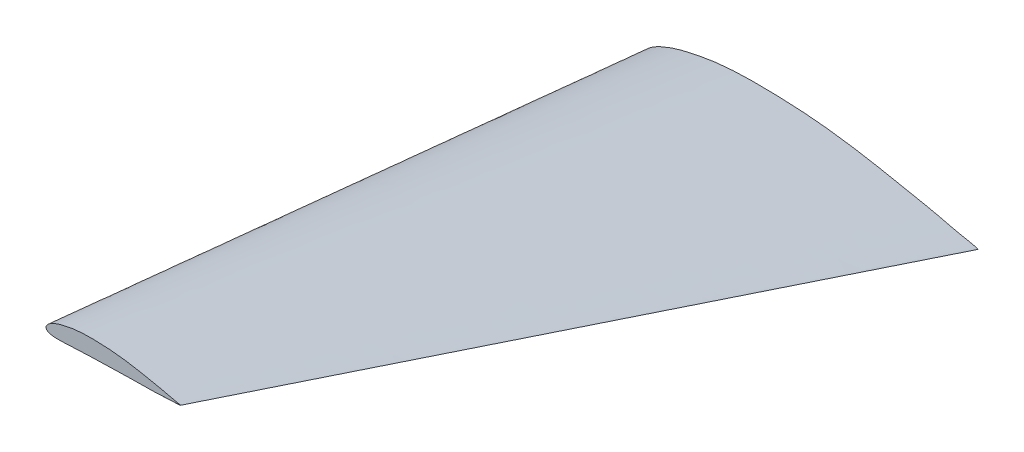
ISO-10303-21;
HEADER;
FILE_DESCRIPTION(('STEP AP214'),'2;1');
FILE_NAME('part.step','',(''),(''),'','','');
FILE_SCHEMA(('AUTOMOTIVE_DESIGN { 1 0 10303 214 1 1 1 1 }'));
ENDSEC;
DATA;
#1=APPLICATION_CONTEXT('core data for automotive mechanical design processes');
#2=APPLICATION_PROTOCOL_DEFINITION('international standard','automotive_design',2000,#1);
#3=PRODUCT_CONTEXT('',#1,'mechanical');
#4=PRODUCT('Part','Part','',(#3));
#5=PRODUCT_RELATED_PRODUCT_CATEGORY('part','',(#4));
#6=PRODUCT_DEFINITION_FORMATION('','',#4);
#7=PRODUCT_DEFINITION_CONTEXT('part definition',#1,'design');
#8=PRODUCT_DEFINITION('design','',#6,#7);
#9=PRODUCT_DEFINITION_SHAPE('','',#8);
#10=(LENGTH_UNIT() NAMED_UNIT(*) SI_UNIT(.MILLI.,.METRE.));
#11=(NAMED_UNIT(*) PLANE_ANGLE_UNIT() SI_UNIT($,.RADIAN.));
#12=(NAMED_UNIT(*) SI_UNIT($,.STERADIAN.) SOLID_ANGLE_UNIT());
#13=UNCERTAINTY_MEASURE_WITH_UNIT(LENGTH_MEASURE(1.E-05),#10,'distance_accuracy_value','');
#14=(GEOMETRIC_REPRESENTATION_CONTEXT(3) GLOBAL_UNCERTAINTY_ASSIGNED_CONTEXT((#13)) GLOBAL_UNIT_ASSIGNED_CONTEXT((#10,
#11,#12)) REPRESENTATION_CONTEXT('',''));
#15=CARTESIAN_POINT('',(0.,0.,0.));
#16=DIRECTION('',(0.,0.,1.));
#17=DIRECTION('',(1.,0.,0.));
#18=AXIS2_PLACEMENT_3D('',#15,#16,#17);
#19=CARTESIAN_POINT('',(2.22763695386201,8.33176325944868,0.));
#20=DIRECTION('',(0.,0.,-1.));
#21=DIRECTION('',(-1.,0.,0.));
#22=AXIS2_PLACEMENT_3D('',#19,#20,#21);
#23=PLANE('',#22);
#24=CARTESIAN_POINT('',(712.47,2.07335319557443,0.));
#25=CARTESIAN_POINT('',(712.827548538168,3.84097164175555,0.));
#26=CARTESIAN_POINT('',(670.979067480719,10.900668991435,0.));
#27=CARTESIAN_POINT('',(632.032174058292,21.4886568376294,0.));
#28=CARTESIAN_POINT('',(567.937378051037,34.4166958651483,0.));
#29=CARTESIAN_POINT('',(497.653335818671,48.3711161421559,0.));
#30=CARTESIAN_POINT('',(425.756769364403,60.5617744640612,0.));
#31=CARTESIAN_POINT('',(354.238219722509,68.5404792304792,0.));
#32=CARTESIAN_POINT('',(282.703204337879,71.8290466645112,0.));
#33=CARTESIAN_POINT('',(211.372720245675,72.4475669461072,0.));
#34=CARTESIAN_POINT('',(151.808177451207,67.8903713086704,0.));
#35=CARTESIAN_POINT('',(104.829261662245,58.4090664260277,0.));
#36=CARTESIAN_POINT('',(75.1324878470729,51.7582758449611,0.));
#37=CARTESIAN_POINT('',(51.8286837630546,43.2656194394777,0.));
#38=CARTESIAN_POINT('',(34.0169628969557,35.649256193493,0.));
#39=CARTESIAN_POINT('',(19.0212273479182,26.9087588195143,0.));
#40=CARTESIAN_POINT('',(6.03110365597778,15.6646122569084,0.));
#41=CARTESIAN_POINT('',(-4.30816842668138,-0.816384251834602,0.));
#42=CARTESIAN_POINT('',(7.52868726112552,-14.5769539317448,0.));
#43=CARTESIAN_POINT('',(21.0543493383765,-19.7693583870716,0.));
#44=CARTESIAN_POINT('',(36.3712181572779,-22.1104614759648,0.));
#45=CARTESIAN_POINT('',(54.2904993022433,-23.1785056714647,0.));
#46=CARTESIAN_POINT('',(78.0813724521837,-23.2604764279844,0.));
#47=CARTESIAN_POINT('',(107.709140300682,-21.499318081292,0.));
#48=CARTESIAN_POINT('',(155.111522781106,-18.9570776901827,0.));
#49=CARTESIAN_POINT('',(214.380182594991,-15.9364536047703,0.));
#50=CARTESIAN_POINT('',(285.528718842779,-13.2372439516707,0.));
#51=CARTESIAN_POINT('',(356.715816883495,-10.8993207831234,0.));
#52=CARTESIAN_POINT('',(427.793043584432,-8.28290170668751,0.));
#53=CARTESIAN_POINT('',(499.362897072907,-8.55747667231418,0.));
#54=CARTESIAN_POINT('',(569.251662868548,-6.09413105148152,0.));
#55=CARTESIAN_POINT('',(632.552792895558,-3.63429470637399,0.));
#56=CARTESIAN_POINT('',(671.724189770294,0.239167365984864,0.));
#57=CARTESIAN_POINT('',(712.124617719546,0.365881272900717,0.));
#58=CARTESIAN_POINT('',(712.47,2.07335319557443,0.));
#59=B_SPLINE_CURVE_WITH_KNOTS('',3,(#24,#25,#26,#27,#28,#29,#30,#31,#32,#33,#34,#35,#36,#37,#38,
#39,#40,#41,#42,#43,#44,#45,#46,#47,#48,#49,#50,#51,#52,#53,#54,#55,#56,#57,#58),.UNSPECIFIED.,
.T.,.F.,(4,1,1,1,1,1,1,1,1,1,1,1,1,1,1,1,1,1,1,1,1,1,1,1,1,1,1,1,1,1,1,1,4),(0.,
0.0252169140871818,0.0504374300638924,0.100628204712043,0.15059108089882,0.200248429430446,
0.249449530338381,0.298317568138258,0.347040871796643,0.395806423450747,0.420447896139902,
0.445348578182175,0.458128100057384,0.471238019089944,0.485189431216555,0.493138961287094,
0.507404969256246,0.518075314640872,0.524826618563054,0.537292344987258,0.549525948322805,
0.561709771644772,0.586054970236642,0.610405688866972,0.659105887800836,0.707801766596212,
0.756490254805211,0.805187016565533,0.853894976021796,0.902586867875153,0.951286855099002,
0.975641138576392,1.),.UNSPECIFIED.);
#60=CARTESIAN_POINT('',(712.47,2.07335319557443,0.));
#61=VERTEX_POINT('',#60);
#62=EDGE_CURVE('E12',#61,#61,#59,.T.);
#63=ORIENTED_EDGE('',*,*,#62,.F.);
#64=EDGE_LOOP('',(#63));
#65=FACE_BOUND('',#64,.T.);
#66=ADVANCED_FACE('F53',(#65),#23,.T.);
#67=CARTESIAN_POINT('',(107.793636482975,245.176102798593,1371.6));
#68=DIRECTION('',(0.,0.,-1.));
#69=DIRECTION('',(-1.,0.,0.));
#70=AXIS2_PLACEMENT_3D('',#67,#68,#69);
#71=PLANE('',#70);
#72=CARTESIAN_POINT('',(391.8712,241.019298721812,1371.6));
#73=CARTESIAN_POINT('',(392.018332103817,241.725501732691,1371.6));
#74=CARTESIAN_POINT('',(375.295658553475,244.646758360626,1371.6));
#75=CARTESIAN_POINT('',(359.741814449511,248.97255223133,1371.6));
#76=CARTESIAN_POINT('',(334.134427450006,254.292896391907,1371.6));
#77=CARTESIAN_POINT('',(306.053773362471,260.038194997057,1371.6));
#78=CARTESIAN_POINT('',(277.324014378017,265.081754812575,1371.6));
#79=CARTESIAN_POINT('',(248.735653902914,268.439681697768,1371.6));
#80=CARTESIAN_POINT('',(220.129788350105,269.921623758121,1371.6));
#81=CARTESIAN_POINT('',(191.599517915108,270.335088886814,1371.6));
#82=CARTESIAN_POINT('',(167.763494941461,268.650910967934,1371.6));
#83=CARTESIAN_POINT('',(148.950173912902,264.967822693969,1371.6));
#84=CARTESIAN_POINT('',(137.056182179579,262.37668720757,1371.6));
#85=CARTESIAN_POINT('',(127.715047064522,259.033934692125,1371.6));
#86=CARTESIAN_POINT('',(120.572748086232,256.028907638373,1371.6));
#87=CARTESIAN_POINT('',(114.554207112129,252.567678783872,1371.6));
#88=CARTESIAN_POINT('',(109.33206866307,248.100338043411,1371.6));
#89=CARTESIAN_POINT('',(105.158061230044,241.532121478138,1371.6));
#90=CARTESIAN_POINT('',(109.860687965339,236.000429994801,1371.6));
#91=CARTESIAN_POINT('',(115.258772964838,233.89201492108,1371.6));
#92=CARTESIAN_POINT('',(121.379966508896,232.919931051083,1371.6));
#93=CARTESIAN_POINT('',(128.545071102052,232.451003557686,1371.6));
#94=CARTESIAN_POINT('',(138.061068350083,232.362829377145,1371.6));
#95=CARTESIAN_POINT('',(149.916074837208,232.998305745927,1371.6));
#96=CARTESIAN_POINT('',(168.882625157786,233.904829381154,1371.6));
#97=CARTESIAN_POINT('',(192.596719722482,234.975077920771,1371.6));
#98=CARTESIAN_POINT('',(221.061936106252,235.889105873208,1371.6));
#99=CARTESIAN_POINT('',(249.54173585156,236.658531905556,1371.6));
#100=CARTESIAN_POINT('',(277.978236158782,237.539610200684,1371.6));
#101=CARTESIAN_POINT('',(306.605053453804,237.263163603363,1371.6));
#102=CARTESIAN_POINT('',(334.565821087309,238.085780354258,1371.6));
#103=CARTESIAN_POINT('',(359.891570873827,238.922329789297,1371.6));
#104=CARTESIAN_POINT('',(375.568881871557,240.38049525573,1371.6));
#105=CARTESIAN_POINT('',(391.729074341189,240.33712558915,1371.6));
#106=CARTESIAN_POINT('',(391.8712,241.019298721812,1371.6));
#107=B_SPLINE_CURVE_WITH_KNOTS('',3,(#72,#73,#74,#75,#76,#77,#78,#79,#80,#81,#82,#83,#84,#85,
#86,#87,#88,#89,#90,#91,#92,#93,#94,#95,#96,#97,#98,#99,#100,#101,#102,#103,#104,#105,#106),
.UNSPECIFIED.,.T.,.F.,(4,1,1,1,1,1,1,1,1,1,1,1,1,1,1,1,1,1,1,1,1,1,1,1,1,1,1,1,1,1,1,1,4),(0.,
0.0252169140871818,0.0504374300638924,0.100628204712043,0.15059108089882,0.200248429430446,
0.249449530338381,0.298317568138258,0.347040871796643,0.395806423450747,0.420447896139902,
0.445348578182175,0.458128100057384,0.471238019089944,0.485189431216555,0.493138961287094,
0.507404969256246,0.518075314640872,0.524826618563054,0.537292344987258,0.549525948322805,
0.561709771644772,0.586054970236642,0.610405688866972,0.659105887800836,0.707801766596212,
0.756490254805211,0.805187016565533,0.853894976021796,0.902586867875153,0.951286855099002,
0.975641138576392,1.),.UNSPECIFIED.);
#108=CARTESIAN_POINT('',(391.8712,241.019298721812,1371.6));
#109=VERTEX_POINT('',#108);
#110=EDGE_CURVE('E63',#109,#109,#107,.T.);
#111=ORIENTED_EDGE('',*,*,#110,.T.);
#112=EDGE_LOOP('',(#111));
#113=FACE_BOUND('',#112,.T.);
#114=ADVANCED_FACE('F92',(#113),#71,.F.);
#115=CARTESIAN_POINT('',(391.8712,241.019298721812,1371.6));
#116=CARTESIAN_POINT('',(498.737466666667,161.370650213066,914.4));
#117=CARTESIAN_POINT('',(605.603733333333,81.7220017043204,457.2));
#118=CARTESIAN_POINT('',(712.47,2.07335319557444,0.));
#119=CARTESIAN_POINT('',(391.729074341189,240.33712558915,1371.6));
#120=CARTESIAN_POINT('',(498.527588800641,160.346710817067,914.4));
#121=CARTESIAN_POINT('',(605.326103260093,80.3562960449837,457.2));
#122=CARTESIAN_POINT('',(712.124617719545,0.365881272900748,0.));
#123=CARTESIAN_POINT('',(375.568881871557,240.38049525573,1371.6));
#124=CARTESIAN_POINT('',(474.287317837803,160.333385959148,914.4));
#125=CARTESIAN_POINT('',(573.005753804048,80.2862766625666,457.2));
#126=CARTESIAN_POINT('',(671.724189770294,0.239167365984864,0.));
#127=CARTESIAN_POINT('',(359.891570873827,238.922329789297,1371.6));
#128=CARTESIAN_POINT('',(450.778644881071,158.070121624073,914.4));
#129=CARTESIAN_POINT('',(541.665718888314,77.2179134588496,457.2));
#130=CARTESIAN_POINT('',(632.552792895558,-3.63429470637399,0.));
#131=CARTESIAN_POINT('',(334.565821087309,238.085780354258,1371.6));
#132=CARTESIAN_POINT('',(412.794435014389,156.692476552345,914.4));
#133=CARTESIAN_POINT('',(491.023048941469,75.2991727504317,457.2));
#134=CARTESIAN_POINT('',(569.251662868548,-6.09413105148152,0.));
#135=CARTESIAN_POINT('',(306.605053453804,237.263163603363,1371.6));
#136=CARTESIAN_POINT('',(370.857667993505,155.322950178137,914.4));
#137=CARTESIAN_POINT('',(435.110282533206,73.3827367529115,457.2));
#138=CARTESIAN_POINT('',(499.362897072907,-8.55747667231418,0.));
#139=CARTESIAN_POINT('',(277.978236158782,237.539610200684,1371.6));
#140=CARTESIAN_POINT('',(327.916505300666,155.598772898227,914.4));
#141=CARTESIAN_POINT('',(377.854774442549,73.6579355957698,457.2));
#142=CARTESIAN_POINT('',(427.793043584432,-8.28290170668751,0.));
#143=CARTESIAN_POINT('',(249.54173585156,236.658531905556,1371.6));
#144=CARTESIAN_POINT('',(285.266429528871,154.139247675996,914.4));
#145=CARTESIAN_POINT('',(320.991123206183,71.6199634464363,457.2));
#146=CARTESIAN_POINT('',(356.715816883495,-10.8993207831234,0.));
#147=CARTESIAN_POINT('',(221.061936106252,235.889105873208,1371.6));
#148=CARTESIAN_POINT('',(242.550863685094,152.846989264915,914.4));
#149=CARTESIAN_POINT('',(264.039791263936,69.8048726566221,457.2));
#150=CARTESIAN_POINT('',(285.528718842779,-13.2372439516707,0.));
#151=CARTESIAN_POINT('',(192.596719722482,234.975077920771,1371.6));
#152=CARTESIAN_POINT('',(199.857874013319,151.337900745591,914.4));
#153=CARTESIAN_POINT('',(207.119028304155,67.7007235704102,457.2));
#154=CARTESIAN_POINT('',(214.380182594991,-15.9364536047703,0.));
#155=CARTESIAN_POINT('',(168.882625157786,233.904829381154,1371.6));
#156=CARTESIAN_POINT('',(164.292257698893,149.617527024042,914.4));
#157=CARTESIAN_POINT('',(159.701890239999,65.3302246669295,457.2));
#158=CARTESIAN_POINT('',(155.111522781106,-18.9570776901827,0.));
#159=CARTESIAN_POINT('',(149.916074837208,232.998305745927,1371.6));
#160=CARTESIAN_POINT('',(135.847096658366,148.165764470188,914.4));
#161=CARTESIAN_POINT('',(121.778118479524,63.3332231944478,457.2));
#162=CARTESIAN_POINT('',(107.709140300682,-21.499318081292,0.));
#163=CARTESIAN_POINT('',(138.061068350083,232.362829377145,1371.6));
#164=CARTESIAN_POINT('',(118.067836384116,147.155060775435,914.4));
#165=CARTESIAN_POINT('',(98.07460441815,61.9472921737255,457.2));
#166=CARTESIAN_POINT('',(78.0813724521837,-23.2604764279844,0.));
#167=CARTESIAN_POINT('',(128.545071102052,232.451003557686,1371.6));
#168=CARTESIAN_POINT('',(103.793547168783,147.241167147969,914.4));
#169=CARTESIAN_POINT('',(79.0420232355129,62.0313307382521,457.2));
#170=CARTESIAN_POINT('',(54.2904993022433,-23.1785056714647,0.));
#171=CARTESIAN_POINT('',(121.379966508896,232.919931051083,1371.6));
#172=CARTESIAN_POINT('',(93.0437170583565,147.909800208734,914.4));
#173=CARTESIAN_POINT('',(64.7074676078172,62.8996693663845,457.2));
#174=CARTESIAN_POINT('',(36.3712181572779,-22.1104614759648,0.));
#175=CARTESIAN_POINT('',(115.258772964838,233.89201492108,1371.6));
#176=CARTESIAN_POINT('',(83.8572984226842,149.338223818363,914.4));
#177=CARTESIAN_POINT('',(52.4558238805304,64.7844327156457,457.2));
#178=CARTESIAN_POINT('',(21.0543493383765,-19.7693583870716,0.));
#179=CARTESIAN_POINT('',(109.860687965339,236.000429994801,1371.6));
#180=CARTESIAN_POINT('',(75.7500210639346,152.474635352619,914.4));
#181=CARTESIAN_POINT('',(41.63935416253,68.9488407104372,457.2));
#182=CARTESIAN_POINT('',(7.52868726112552,-14.5769539317448,0.));
#183=CARTESIAN_POINT('',(105.158061230044,241.532121478138,1371.6));
#184=CARTESIAN_POINT('',(68.6693180111354,160.749286234814,914.4));
#185=CARTESIAN_POINT('',(32.180574792227,79.9664509914898,457.2));
#186=CARTESIAN_POINT('',(-4.30816842668138,-0.816384251834602,0.));
#187=CARTESIAN_POINT('',(109.33206866307,248.100338043411,1371.6));
#188=CARTESIAN_POINT('',(74.8984136607058,170.621762781243,914.4));
#189=CARTESIAN_POINT('',(40.4647586583418,93.1431875190759,457.2));
#190=CARTESIAN_POINT('',(6.03110365597778,15.6646122569084,0.));
#191=CARTESIAN_POINT('',(114.554207112129,252.567678783872,1371.6));
#192=CARTESIAN_POINT('',(82.7098805240585,177.348038795753,914.4));
#193=CARTESIAN_POINT('',(50.8655539359884,102.128398807633,457.2));
#194=CARTESIAN_POINT('',(19.0212273479182,26.9087588195143,0.));
#195=CARTESIAN_POINT('',(120.572748086232,256.028907638373,1371.6));
#196=CARTESIAN_POINT('',(91.7208196898066,182.569023823413,914.4));
#197=CARTESIAN_POINT('',(62.8688912933811,109.109140008453,457.2));
#198=CARTESIAN_POINT('',(34.0169628969557,35.649256193493,0.));
#199=CARTESIAN_POINT('',(127.715047064522,259.033934692125,1371.6));
#200=CARTESIAN_POINT('',(102.419592630699,187.111162941242,914.4));
#201=CARTESIAN_POINT('',(77.124138196877,115.18839119036,457.2));
#202=CARTESIAN_POINT('',(51.8286837630546,43.2656194394777,0.));
#203=CARTESIAN_POINT('',(137.056182179579,262.37668720757,1371.6));
#204=CARTESIAN_POINT('',(116.41495073541,192.1705500867,914.4));
#205=CARTESIAN_POINT('',(95.7737192912415,121.964412965831,457.2));
#206=CARTESIAN_POINT('',(75.1324878470729,51.7582758449611,0.));
#207=CARTESIAN_POINT('',(148.950173912902,264.967822693969,1371.6));
#208=CARTESIAN_POINT('',(134.243203162683,196.114903937988,914.4));
#209=CARTESIAN_POINT('',(119.536232412464,127.261985182008,457.2));
#210=CARTESIAN_POINT('',(104.829261662245,58.4090664260277,0.));
#211=CARTESIAN_POINT('',(167.763494941461,268.650910967934,1371.6));
#212=CARTESIAN_POINT('',(162.445055778043,201.730731081513,914.4));
#213=CARTESIAN_POINT('',(157.126616614625,134.810551195092,457.2));
#214=CARTESIAN_POINT('',(151.808177451207,67.8903713086704,0.));
#215=CARTESIAN_POINT('',(191.599517915108,270.335088886814,1371.6));
#216=CARTESIAN_POINT('',(198.19058535863,204.372581573245,914.4));
#217=CARTESIAN_POINT('',(204.781652802152,138.410074259676,457.2));
#218=CARTESIAN_POINT('',(211.372720245675,72.4475669461072,0.));
#219=CARTESIAN_POINT('',(220.129788350105,269.921623758121,1371.6));
#220=CARTESIAN_POINT('',(240.987593679363,203.890764726918,914.4));
#221=CARTESIAN_POINT('',(261.845399008621,137.859905695715,457.2));
#222=CARTESIAN_POINT('',(282.703204337879,71.8290466645112,0.));
#223=CARTESIAN_POINT('',(248.735653902914,268.439681697768,1371.6));
#224=CARTESIAN_POINT('',(283.903175842779,201.806614208672,914.4));
#225=CARTESIAN_POINT('',(319.070697782644,135.173546719575,457.2));
#226=CARTESIAN_POINT('',(354.238219722509,68.5404792304792,0.));
#227=CARTESIAN_POINT('',(277.324014378017,265.081754812575,1371.6));
#228=CARTESIAN_POINT('',(326.801599373479,196.908428029737,914.4));
#229=CARTESIAN_POINT('',(376.279184368941,128.735101246899,457.2));
#230=CARTESIAN_POINT('',(425.756769364403,60.5617744640612,0.));
#231=CARTESIAN_POINT('',(306.053773362471,260.038194997057,1371.6));
#232=CARTESIAN_POINT('',(369.920294181204,189.482502045423,914.4));
#233=CARTESIAN_POINT('',(433.786814999938,118.92680909379,457.2));
#234=CARTESIAN_POINT('',(497.653335818671,48.3711161421559,0.));
#235=CARTESIAN_POINT('',(334.134427450006,254.292896391907,1371.6));
#236=CARTESIAN_POINT('',(412.068744317016,181.000829549654,914.4));
#237=CARTESIAN_POINT('',(490.003061184027,107.708762707401,457.2));
#238=CARTESIAN_POINT('',(567.937378051037,34.4166958651483,0.));
#239=CARTESIAN_POINT('',(359.741814449511,248.97255223133,1371.6));
#240=CARTESIAN_POINT('',(450.505267652438,173.144587100096,914.4));
#241=CARTESIAN_POINT('',(541.268720855365,97.3166219688629,457.2));
#242=CARTESIAN_POINT('',(632.032174058292,21.4886568376294,0.));
#243=CARTESIAN_POINT('',(374.51611577694,244.863562730154,1371.6));
#244=CARTESIAN_POINT('',(472.686440174928,167.052817861935,914.4));
#245=CARTESIAN_POINT('',(570.856764572916,89.2420729937161,457.2));
#246=CARTESIAN_POINT('',(669.027088970904,11.4313281254971,0.));
#247=CARTESIAN_POINT('',(390.346184170456,242.017606533907,1371.6));
#248=CARTESIAN_POINT('',(496.445122542001,162.860701343034,914.4));
#249=CARTESIAN_POINT('',(602.544060913547,83.7037961521611,457.2));
#250=CARTESIAN_POINT('',(708.642999285092,4.54689096128812,0.));
#251=CARTESIAN_POINT('',(391.900626420764,241.160539323988,1371.6));
#252=CARTESIAN_POINT('',(498.78092084972,161.582651844262,914.4));
#253=CARTESIAN_POINT('',(605.661215278677,82.0047643645365,457.2));
#254=CARTESIAN_POINT('',(712.541509707634,2.42687688481066,0.));
#255=CARTESIAN_POINT('',(391.8712,241.019298721812,1371.6));
#256=CARTESIAN_POINT('',(498.737466666667,161.370650213066,914.4));
#257=CARTESIAN_POINT('',(605.603733333333,81.7220017043204,457.2));
#258=CARTESIAN_POINT('',(712.47,2.07335319557444,0.));
#259=B_SPLINE_SURFACE_WITH_KNOTS('',3,3,((#115,#116,#117,#118),(#119,#120,#121,#122),(#123,#124,
#125,#126),(#127,#128,#129,#130),(#131,#132,#133,#134),(#135,#136,#137,#138),(#139,#140,#141,
#142),(#143,#144,#145,#146),(#147,#148,#149,#150),(#151,#152,#153,#154),(#155,#156,#157,#158),
(#159,#160,#161,#162),(#163,#164,#165,#166),(#167,#168,#169,#170),(#171,#172,#173,#174),(#175,
#176,#177,#178),(#179,#180,#181,#182),(#183,#184,#185,#186),(#187,#188,#189,#190),(#191,#192,
#193,#194),(#195,#196,#197,#198),(#199,#200,#201,#202),(#203,#204,#205,#206),(#207,#208,#209,
#210),(#211,#212,#213,#214),(#215,#216,#217,#218),(#219,#220,#221,#222),(#223,#224,#225,#226),
(#227,#228,#229,#230),(#231,#232,#233,#234),(#235,#236,#237,#238),(#239,#240,#241,#242),(#243,
#244,#245,#246),(#247,#248,#249,#250),(#251,#252,#253,#254),(#255,#256,#257,#258)),
.UNSPECIFIED.,.T.,.F.,.F.,(4,1,1,1,1,1,1,1,1,1,1,1,1,1,1,1,1,1,1,1,1,1,1,1,1,1,1,1,1,1,1,1,1,4),
(4,4),(0.,0.0243588614236076,0.0487131449009981,0.0974131321248465,0.146105023978204,
0.194812983434467,0.243509745194789,0.292198233403788,0.340894112199164,0.389594311133028,
0.413945029763358,0.438290228355228,0.450474051677195,0.462707655012742,0.475173381436946,
0.481924685359128,0.492595030743754,0.506861038712907,0.514810568783445,0.528761980910056,
0.541871899942616,0.554651421817825,0.579552103860098,0.604193576549253,0.652959128203357,
0.701682431861742,0.750550469661619,0.799751570569555,0.84940891910118,0.899371795287957,
0.949562569936108,0.974783085912818,0.994956617182564,1.),(0.,1.),.UNSPECIFIED.);
#260=ORIENTED_EDGE('',*,*,#110,.F.);
#261=EDGE_LOOP('',(#260));
#262=FACE_BOUND('',#261,.T.);
#263=ORIENTED_EDGE('',*,*,#62,.T.);
#264=EDGE_LOOP('',(#263));
#265=FACE_BOUND('',#264,.T.);
#266=ADVANCED_FACE('F100',(#262,#265),#259,.T.);
#267=CLOSED_SHELL('',(#66,#114,#266));
#268=MANIFOLD_SOLID_BREP('B2',#267);
#269=ADVANCED_BREP_SHAPE_REPRESENTATION('',(#18,#268),#14);
#270=SHAPE_DEFINITION_REPRESENTATION(#9,#269);
ENDSEC;
END-ISO-10303-21;
